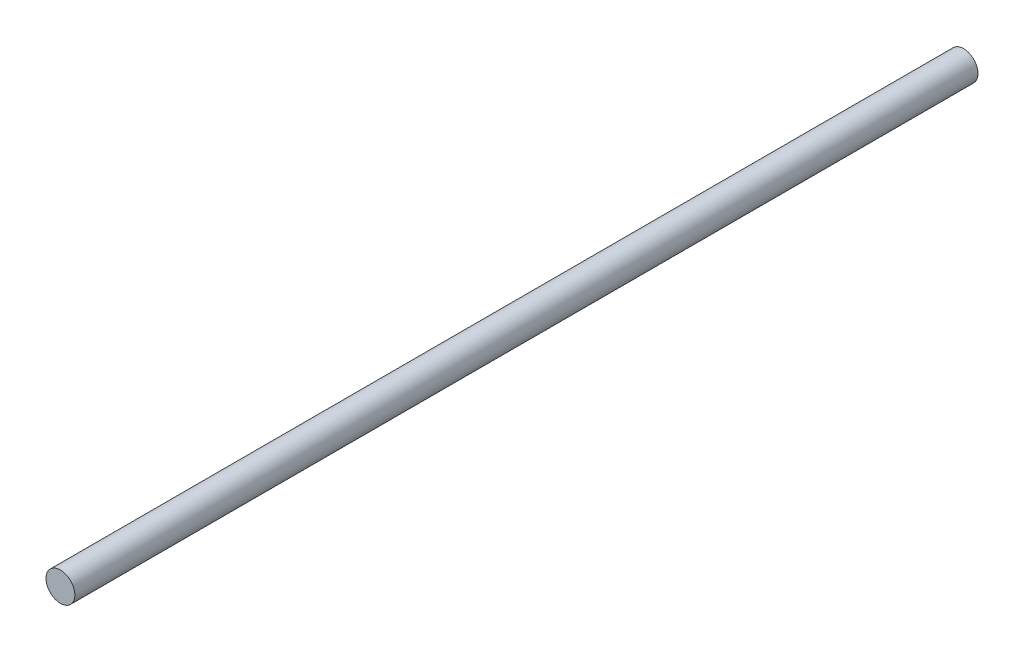
ISO-10303-21;
HEADER;
FILE_DESCRIPTION(('STEP AP214'),'2;1');
FILE_NAME('part.step','',(''),(''),'','','');
FILE_SCHEMA(('AUTOMOTIVE_DESIGN { 1 0 10303 214 1 1 1 1 }'));
ENDSEC;
DATA;
#1=APPLICATION_CONTEXT('core data for automotive mechanical design processes');
#2=APPLICATION_PROTOCOL_DEFINITION('international standard','automotive_design',2000,#1);
#3=PRODUCT_CONTEXT('',#1,'mechanical');
#4=PRODUCT('Part','Part','',(#3));
#5=PRODUCT_RELATED_PRODUCT_CATEGORY('part','',(#4));
#6=PRODUCT_DEFINITION_FORMATION('','',#4);
#7=PRODUCT_DEFINITION_CONTEXT('part definition',#1,'design');
#8=PRODUCT_DEFINITION('design','',#6,#7);
#9=PRODUCT_DEFINITION_SHAPE('','',#8);
#10=(LENGTH_UNIT() NAMED_UNIT(*) SI_UNIT(.MILLI.,.METRE.));
#11=(NAMED_UNIT(*) PLANE_ANGLE_UNIT() SI_UNIT($,.RADIAN.));
#12=(NAMED_UNIT(*) SI_UNIT($,.STERADIAN.) SOLID_ANGLE_UNIT());
#13=UNCERTAINTY_MEASURE_WITH_UNIT(LENGTH_MEASURE(1.E-05),#10,'distance_accuracy_value','');
#14=(GEOMETRIC_REPRESENTATION_CONTEXT(3) GLOBAL_UNCERTAINTY_ASSIGNED_CONTEXT((#13)) GLOBAL_UNIT_ASSIGNED_CONTEXT((#10,
#11,#12)) REPRESENTATION_CONTEXT('',''));
#15=CARTESIAN_POINT('',(0.,0.,0.));
#16=DIRECTION('',(0.,0.,1.));
#17=DIRECTION('',(1.,0.,0.));
#18=AXIS2_PLACEMENT_3D('',#15,#16,#17);
#19=CARTESIAN_POINT('',(0.,0.,-25.4));
#20=DIRECTION('',(0.,0.,1.));
#21=DIRECTION('',(1.,0.,0.));
#22=AXIS2_PLACEMENT_3D('',#19,#20,#21);
#23=CYLINDRICAL_SURFACE('',#22,0.406400000000001);
#24=CARTESIAN_POINT('',(0.,0.,-25.4));
#25=DIRECTION('',(0.,0.,1.));
#26=DIRECTION('',(1.,0.,0.));
#27=AXIS2_PLACEMENT_3D('',#24,#25,#26);
#28=CIRCLE('',#27,0.406400000000001);
#29=CARTESIAN_POINT('',(0.406400000000001,0.,-25.4));
#30=VERTEX_POINT('',#29);
#31=EDGE_CURVE('E10',#30,#30,#28,.T.);
#32=ORIENTED_EDGE('',*,*,#31,.T.);
#33=EDGE_LOOP('',(#32));
#34=FACE_BOUND('',#33,.T.);
#35=CARTESIAN_POINT('',(0.,0.,0.));
#36=DIRECTION('',(0.,0.,1.));
#37=DIRECTION('',(1.,0.,0.));
#38=AXIS2_PLACEMENT_3D('',#35,#36,#37);
#39=CIRCLE('',#38,0.406400000000001);
#40=CARTESIAN_POINT('',(0.406400000000001,0.,0.));
#41=VERTEX_POINT('',#40);
#42=EDGE_CURVE('E34',#41,#41,#39,.T.);
#43=ORIENTED_EDGE('',*,*,#42,.F.);
#44=EDGE_LOOP('',(#43));
#45=FACE_BOUND('',#44,.T.);
#46=ADVANCED_FACE('F31',(#34,#45),#23,.T.);
#47=CARTESIAN_POINT('',(0.,0.,-25.4));
#48=DIRECTION('',(0.,0.,1.));
#49=DIRECTION('',(1.,0.,0.));
#50=AXIS2_PLACEMENT_3D('',#47,#48,#49);
#51=PLANE('',#50);
#52=ORIENTED_EDGE('',*,*,#31,.F.);
#53=EDGE_LOOP('',(#52));
#54=FACE_BOUND('',#53,.T.);
#55=ADVANCED_FACE('F46',(#54),#51,.F.);
#56=CARTESIAN_POINT('',(0.,0.,0.));
#57=DIRECTION('',(0.,0.,1.));
#58=DIRECTION('',(1.,0.,0.));
#59=AXIS2_PLACEMENT_3D('',#56,#57,#58);
#60=PLANE('',#59);
#61=ORIENTED_EDGE('',*,*,#42,.T.);
#62=EDGE_LOOP('',(#61));
#63=FACE_BOUND('',#62,.T.);
#64=ADVANCED_FACE('F43',(#63),#60,.T.);
#65=CLOSED_SHELL('',(#46,#55,#64));
#66=MANIFOLD_SOLID_BREP('B2',#65);
#67=ADVANCED_BREP_SHAPE_REPRESENTATION('',(#18,#66),#14);
#68=SHAPE_DEFINITION_REPRESENTATION(#9,#67);
ENDSEC;
END-ISO-10303-21;
